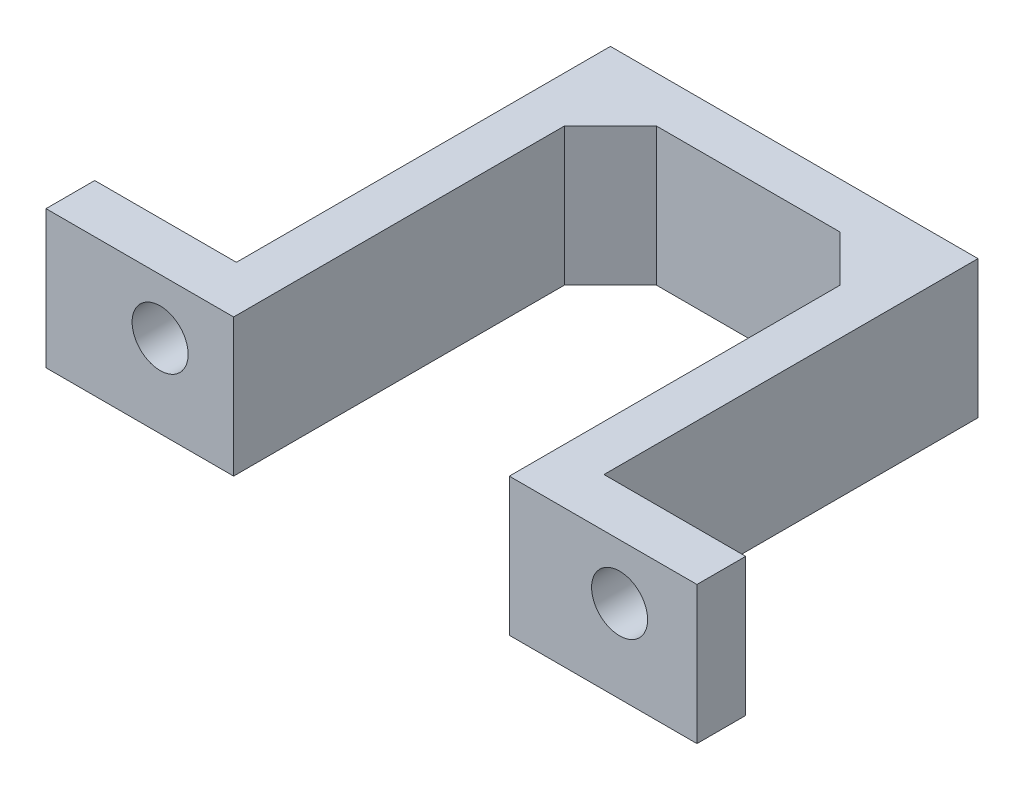
ISO-10303-21;
HEADER;
FILE_DESCRIPTION(('STEP AP214'),'2;1');
FILE_NAME('part.step','',(''),(''),'','','');
FILE_SCHEMA(('AUTOMOTIVE_DESIGN { 1 0 10303 214 1 1 1 1 }'));
ENDSEC;
DATA;
#1=APPLICATION_CONTEXT('core data for automotive mechanical design processes');
#2=APPLICATION_PROTOCOL_DEFINITION('international standard','automotive_design',2000,#1);
#3=PRODUCT_CONTEXT('',#1,'mechanical');
#4=PRODUCT('Part','Part','',(#3));
#5=PRODUCT_RELATED_PRODUCT_CATEGORY('part','',(#4));
#6=PRODUCT_DEFINITION_FORMATION('','',#4);
#7=PRODUCT_DEFINITION_CONTEXT('part definition',#1,'design');
#8=PRODUCT_DEFINITION('design','',#6,#7);
#9=PRODUCT_DEFINITION_SHAPE('','',#8);
#10=(LENGTH_UNIT() NAMED_UNIT(*) SI_UNIT(.MILLI.,.METRE.));
#11=(NAMED_UNIT(*) PLANE_ANGLE_UNIT() SI_UNIT($,.RADIAN.));
#12=(NAMED_UNIT(*) SI_UNIT($,.STERADIAN.) SOLID_ANGLE_UNIT());
#13=UNCERTAINTY_MEASURE_WITH_UNIT(LENGTH_MEASURE(1.E-05),#10,'distance_accuracy_value','');
#14=(GEOMETRIC_REPRESENTATION_CONTEXT(3) GLOBAL_UNCERTAINTY_ASSIGNED_CONTEXT((#13)) GLOBAL_UNIT_ASSIGNED_CONTEXT((#10,
#11,#12)) REPRESENTATION_CONTEXT('',''));
#15=CARTESIAN_POINT('',(0.,0.,0.));
#16=DIRECTION('',(0.,0.,1.));
#17=DIRECTION('',(1.,0.,0.));
#18=AXIS2_PLACEMENT_3D('',#15,#16,#17);
#19=CARTESIAN_POINT('',(31.9173098006345,15.,35.6989528795811));
#20=DIRECTION('',(0.,0.,1.));
#21=DIRECTION('',(1.,0.,0.));
#22=AXIS2_PLACEMENT_3D('',#19,#20,#21);
#23=PLANE('',#22);
#24=CARTESIAN_POINT('',(23.5,9.,35.6989528795811));
#25=DIRECTION('',(0.,0.,-1.));
#26=DIRECTION('',(-1.,0.,0.));
#27=AXIS2_PLACEMENT_3D('',#24,#25,#26);
#28=CIRCLE('',#27,3.05);
#29=CARTESIAN_POINT('',(20.45,9.,35.6989528795811));
#30=VERTEX_POINT('',#29);
#31=EDGE_CURVE('E242',#30,#30,#28,.T.);
#32=ORIENTED_EDGE('',*,*,#31,.F.);
#33=EDGE_LOOP('',(#32));
#34=FACE_BOUND('',#33,.T.);
#35=DIRECTION('',(-1.,0.,0.));
#36=VECTOR('',#35,1.);
#37=CARTESIAN_POINT('',(31.9173098006345,0.,35.6989528795811));
#38=LINE('',#37,#36);
#39=CARTESIAN_POINT('',(31.9173098006345,0.,35.6989528795811));
#40=VERTEX_POINT('',#39);
#41=CARTESIAN_POINT('',(16.5,0.,35.6989528795811));
#42=VERTEX_POINT('',#41);
#43=EDGE_CURVE('E176',#40,#42,#38,.T.);
#44=ORIENTED_EDGE('',*,*,#43,.T.);
#45=DIRECTION('',(0.,-1.,0.));
#46=VECTOR('',#45,1.);
#47=CARTESIAN_POINT('',(16.5,15.,35.6989528795811));
#48=LINE('',#47,#46);
#49=CARTESIAN_POINT('',(16.5,15.,35.6989528795811));
#50=VERTEX_POINT('',#49);
#51=EDGE_CURVE('E11',#50,#42,#48,.T.);
#52=ORIENTED_EDGE('',*,*,#51,.F.);
#53=DIRECTION('',(-1.,0.,0.));
#54=VECTOR('',#53,1.);
#55=CARTESIAN_POINT('',(31.9173098006345,15.,35.6989528795811));
#56=LINE('',#55,#54);
#57=CARTESIAN_POINT('',(31.9173098006345,15.,35.6989528795811));
#58=VERTEX_POINT('',#57);
#59=EDGE_CURVE('E204',#58,#50,#56,.T.);
#60=ORIENTED_EDGE('',*,*,#59,.F.);
#61=DIRECTION('',(0.,-1.,0.));
#62=VECTOR('',#61,1.);
#63=CARTESIAN_POINT('',(31.9173098006345,15.,35.6989528795811));
#64=LINE('',#63,#62);
#65=EDGE_CURVE('E172',#58,#40,#64,.T.);
#66=ORIENTED_EDGE('',*,*,#65,.T.);
#67=EDGE_LOOP('',(#44,#52,#60,#66));
#68=FACE_BOUND('',#67,.T.);
#69=ADVANCED_FACE('F33',(#34,#68),#23,.F.);
#70=CARTESIAN_POINT('',(16.5,15.,35.6989528795811));
#71=DIRECTION('',(-1.,0.,0.));
#72=DIRECTION('',(0.,0.,1.));
#73=AXIS2_PLACEMENT_3D('',#70,#71,#72);
#74=PLANE('',#73);
#75=DIRECTION('',(0.,0.,-1.));
#76=VECTOR('',#75,1.);
#77=CARTESIAN_POINT('',(16.5,0.,35.6989528795811));
#78=LINE('',#77,#76);
#79=CARTESIAN_POINT('',(16.5,0.,-5.));
#80=VERTEX_POINT('',#79);
#81=EDGE_CURVE('E179',#42,#80,#78,.T.);
#82=ORIENTED_EDGE('',*,*,#81,.T.);
#83=DIRECTION('',(0.,-1.,0.));
#84=VECTOR('',#83,1.);
#85=CARTESIAN_POINT('',(16.5,15.,-5.));
#86=LINE('',#85,#84);
#87=CARTESIAN_POINT('',(16.5,15.,-5.));
#88=VERTEX_POINT('',#87);
#89=EDGE_CURVE('E41',#88,#80,#86,.T.);
#90=ORIENTED_EDGE('',*,*,#89,.F.);
#91=DIRECTION('',(0.,0.,-1.));
#92=VECTOR('',#91,1.);
#93=CARTESIAN_POINT('',(16.5,15.,35.6989528795811));
#94=LINE('',#93,#92);
#95=EDGE_CURVE('E116',#50,#88,#94,.T.);
#96=ORIENTED_EDGE('',*,*,#95,.F.);
#97=ORIENTED_EDGE('',*,*,#51,.T.);
#98=EDGE_LOOP('',(#82,#90,#96,#97));
#99=FACE_BOUND('',#98,.T.);
#100=ADVANCED_FACE('F282',(#99),#74,.F.);
#101=CARTESIAN_POINT('',(16.5,15.,-5.));
#102=DIRECTION('',(0.,0.,1.));
#103=DIRECTION('',(1.,0.,0.));
#104=AXIS2_PLACEMENT_3D('',#101,#102,#103);
#105=PLANE('',#104);
#106=DIRECTION('',(-1.,0.,0.));
#107=VECTOR('',#106,1.);
#108=CARTESIAN_POINT('',(16.5,0.,-5.));
#109=LINE('',#108,#107);
#110=CARTESIAN_POINT('',(-23.5,0.,-5.));
#111=VERTEX_POINT('',#110);
#112=EDGE_CURVE('E181',#80,#111,#109,.T.);
#113=ORIENTED_EDGE('',*,*,#112,.T.);
#114=DIRECTION('',(0.,-1.,0.));
#115=VECTOR('',#114,1.);
#116=CARTESIAN_POINT('',(-23.5,15.,-5.));
#117=LINE('',#116,#115);
#118=CARTESIAN_POINT('',(-23.5,15.,-5.));
#119=VERTEX_POINT('',#118);
#120=EDGE_CURVE('E230',#119,#111,#117,.T.);
#121=ORIENTED_EDGE('',*,*,#120,.F.);
#122=DIRECTION('',(-1.,0.,0.));
#123=VECTOR('',#122,1.);
#124=CARTESIAN_POINT('',(16.5,15.,-5.));
#125=LINE('',#124,#123);
#126=EDGE_CURVE('E248',#88,#119,#125,.T.);
#127=ORIENTED_EDGE('',*,*,#126,.F.);
#128=ORIENTED_EDGE('',*,*,#89,.T.);
#129=EDGE_LOOP('',(#113,#121,#127,#128));
#130=FACE_BOUND('',#129,.T.);
#131=ADVANCED_FACE('F285',(#130),#105,.F.);
#132=CARTESIAN_POINT('',(-23.5,15.,-5.));
#133=DIRECTION('',(1.,0.,0.));
#134=DIRECTION('',(0.,0.,-1.));
#135=AXIS2_PLACEMENT_3D('',#132,#133,#134);
#136=PLANE('',#135);
#137=DIRECTION('',(0.,0.,1.));
#138=VECTOR('',#137,1.);
#139=CARTESIAN_POINT('',(-23.5,0.,-5.));
#140=LINE('',#139,#138);
#141=CARTESIAN_POINT('',(-23.5,0.,35.6989528795811));
#142=VERTEX_POINT('',#141);
#143=EDGE_CURVE('E183',#111,#142,#140,.T.);
#144=ORIENTED_EDGE('',*,*,#143,.T.);
#145=DIRECTION('',(0.,-1.,0.));
#146=VECTOR('',#145,1.);
#147=CARTESIAN_POINT('',(-23.5,15.,35.6989528795811));
#148=LINE('',#147,#146);
#149=CARTESIAN_POINT('',(-23.5,8.44999999999997,35.6989528795811));
#150=VERTEX_POINT('',#149);
#151=EDGE_CURVE('E226',#150,#142,#148,.T.);
#152=ORIENTED_EDGE('',*,*,#151,.F.);
#153=CARTESIAN_POINT('',(-23.5,9.55000000000003,35.6989528795811));
#154=VERTEX_POINT('',#153);
#155=EDGE_CURVE('E231',#154,#150,#148,.T.);
#156=ORIENTED_EDGE('',*,*,#155,.F.);
#157=CARTESIAN_POINT('',(-23.5,15.,35.6989528795811));
#158=VERTEX_POINT('',#157);
#159=EDGE_CURVE('E227',#158,#154,#148,.T.);
#160=ORIENTED_EDGE('',*,*,#159,.F.);
#161=DIRECTION('',(0.,0.,1.));
#162=VECTOR('',#161,1.);
#163=CARTESIAN_POINT('',(-23.5,15.,-5.));
#164=LINE('',#163,#162);
#165=EDGE_CURVE('E250',#119,#158,#164,.T.);
#166=ORIENTED_EDGE('',*,*,#165,.F.);
#167=ORIENTED_EDGE('',*,*,#120,.T.);
#168=EDGE_LOOP('',(#144,#152,#156,#160,#166,#167));
#169=FACE_BOUND('',#168,.T.);
#170=ADVANCED_FACE('F290',(#169),#136,.F.);
#171=CARTESIAN_POINT('',(-23.5,15.,35.6989528795811));
#172=DIRECTION('',(0.,0.,1.));
#173=DIRECTION('',(1.,0.,0.));
#174=AXIS2_PLACEMENT_3D('',#171,#172,#173);
#175=PLANE('',#174);
#176=ORIENTED_EDGE('',*,*,#159,.T.);
#177=CARTESIAN_POINT('',(-26.5,9.,35.6989528795811));
#178=DIRECTION('',(0.,0.,-1.));
#179=DIRECTION('',(-1.,0.,0.));
#180=AXIS2_PLACEMENT_3D('',#177,#178,#179);
#181=CIRCLE('',#180,3.05);
#182=EDGE_CURVE('E240',#150,#154,#181,.T.);
#183=ORIENTED_EDGE('',*,*,#182,.F.);
#184=ORIENTED_EDGE('',*,*,#151,.T.);
#185=DIRECTION('',(-1.,0.,0.));
#186=VECTOR('',#185,1.);
#187=CARTESIAN_POINT('',(-23.5,0.,35.6989528795811));
#188=LINE('',#187,#186);
#189=CARTESIAN_POINT('',(-38.9173098006345,0.,35.6989528795811));
#190=VERTEX_POINT('',#189);
#191=EDGE_CURVE('E186',#142,#190,#188,.T.);
#192=ORIENTED_EDGE('',*,*,#191,.T.);
#193=DIRECTION('',(0.,-1.,0.));
#194=VECTOR('',#193,1.);
#195=CARTESIAN_POINT('',(-38.9173098006345,15.,35.6989528795811));
#196=LINE('',#195,#194);
#197=CARTESIAN_POINT('',(-38.9173098006345,15.,35.6989528795811));
#198=VERTEX_POINT('',#197);
#199=EDGE_CURVE('E223',#198,#190,#196,.T.);
#200=ORIENTED_EDGE('',*,*,#199,.F.);
#201=DIRECTION('',(-1.,0.,0.));
#202=VECTOR('',#201,1.);
#203=CARTESIAN_POINT('',(-23.5,15.,35.6989528795811));
#204=LINE('',#203,#202);
#205=EDGE_CURVE('E252',#158,#198,#204,.T.);
#206=ORIENTED_EDGE('',*,*,#205,.F.);
#207=EDGE_LOOP('',(#176,#183,#184,#192,#200,#206));
#208=FACE_BOUND('',#207,.T.);
#209=ADVANCED_FACE('F297',(#208),#175,.F.);
#210=CARTESIAN_POINT('',(-38.9173098006345,15.,35.6989528795811));
#211=DIRECTION('',(1.,0.,0.));
#212=DIRECTION('',(0.,0.,-1.));
#213=AXIS2_PLACEMENT_3D('',#210,#211,#212);
#214=PLANE('',#213);
#215=DIRECTION('',(0.,0.,1.));
#216=VECTOR('',#215,1.);
#217=CARTESIAN_POINT('',(-38.9173098006345,0.,35.6989528795811));
#218=LINE('',#217,#216);
#219=CARTESIAN_POINT('',(-38.9173098006345,0.,41.));
#220=VERTEX_POINT('',#219);
#221=EDGE_CURVE('E188',#190,#220,#218,.T.);
#222=ORIENTED_EDGE('',*,*,#221,.T.);
#223=DIRECTION('',(0.,-1.,0.));
#224=VECTOR('',#223,1.);
#225=CARTESIAN_POINT('',(-38.9173098006345,15.,41.));
#226=LINE('',#225,#224);
#227=CARTESIAN_POINT('',(-38.9173098006345,15.,41.));
#228=VERTEX_POINT('',#227);
#229=EDGE_CURVE('E220',#228,#220,#226,.T.);
#230=ORIENTED_EDGE('',*,*,#229,.F.);
#231=DIRECTION('',(0.,0.,1.));
#232=VECTOR('',#231,1.);
#233=CARTESIAN_POINT('',(-38.9173098006345,15.,35.6989528795811));
#234=LINE('',#233,#232);
#235=EDGE_CURVE('E254',#198,#228,#234,.T.);
#236=ORIENTED_EDGE('',*,*,#235,.F.);
#237=ORIENTED_EDGE('',*,*,#199,.T.);
#238=EDGE_LOOP('',(#222,#230,#236,#237));
#239=FACE_BOUND('',#238,.T.);
#240=ADVANCED_FACE('F301',(#239),#214,.F.);
#241=CARTESIAN_POINT('',(-38.9173098006345,15.,41.));
#242=DIRECTION('',(0.,0.,-1.));
#243=DIRECTION('',(-1.,0.,0.));
#244=AXIS2_PLACEMENT_3D('',#241,#242,#243);
#245=PLANE('',#244);
#246=CARTESIAN_POINT('',(-26.5,9.,41.));
#247=DIRECTION('',(0.,0.,-1.));
#248=DIRECTION('',(-1.,0.,0.));
#249=AXIS2_PLACEMENT_3D('',#246,#247,#248);
#250=CIRCLE('',#249,3.05);
#251=CARTESIAN_POINT('',(-29.55,9.,41.));
#252=VERTEX_POINT('',#251);
#253=EDGE_CURVE('E36',#252,#252,#250,.T.);
#254=ORIENTED_EDGE('',*,*,#253,.T.);
#255=EDGE_LOOP('',(#254));
#256=FACE_BOUND('',#255,.T.);
#257=DIRECTION('',(1.,0.,0.));
#258=VECTOR('',#257,1.);
#259=CARTESIAN_POINT('',(-38.9173098006345,0.,41.));
#260=LINE('',#259,#258);
#261=CARTESIAN_POINT('',(-18.5,0.,41.));
#262=VERTEX_POINT('',#261);
#263=EDGE_CURVE('E190',#220,#262,#260,.T.);
#264=ORIENTED_EDGE('',*,*,#263,.T.);
#265=DIRECTION('',(0.,-1.,0.));
#266=VECTOR('',#265,1.);
#267=CARTESIAN_POINT('',(-18.5,15.,41.));
#268=LINE('',#267,#266);
#269=CARTESIAN_POINT('',(-18.5,15.,41.));
#270=VERTEX_POINT('',#269);
#271=EDGE_CURVE('E217',#270,#262,#268,.T.);
#272=ORIENTED_EDGE('',*,*,#271,.F.);
#273=DIRECTION('',(1.,0.,0.));
#274=VECTOR('',#273,1.);
#275=CARTESIAN_POINT('',(-38.9173098006345,15.,41.));
#276=LINE('',#275,#274);
#277=EDGE_CURVE('E256',#228,#270,#276,.T.);
#278=ORIENTED_EDGE('',*,*,#277,.F.);
#279=ORIENTED_EDGE('',*,*,#229,.T.);
#280=EDGE_LOOP('',(#264,#272,#278,#279));
#281=FACE_BOUND('',#280,.T.);
#282=ADVANCED_FACE('F306',(#256,#281),#245,.F.);
#283=CARTESIAN_POINT('',(-18.5,15.,41.));
#284=DIRECTION('',(-1.,0.,0.));
#285=DIRECTION('',(0.,0.,1.));
#286=AXIS2_PLACEMENT_3D('',#283,#284,#285);
#287=PLANE('',#286);
#288=DIRECTION('',(0.,0.,-1.));
#289=VECTOR('',#288,1.);
#290=CARTESIAN_POINT('',(-18.5,0.,41.));
#291=LINE('',#290,#289);
#292=CARTESIAN_POINT('',(-18.5,0.,5.));
#293=VERTEX_POINT('',#292);
#294=EDGE_CURVE('E192',#262,#293,#291,.T.);
#295=ORIENTED_EDGE('',*,*,#294,.T.);
#296=DIRECTION('',(0.,-1.,0.));
#297=VECTOR('',#296,1.);
#298=CARTESIAN_POINT('',(-18.5,15.,5.));
#299=LINE('',#298,#297);
#300=CARTESIAN_POINT('',(-18.5,15.,5.));
#301=VERTEX_POINT('',#300);
#302=EDGE_CURVE('E214',#301,#293,#299,.T.);
#303=ORIENTED_EDGE('',*,*,#302,.F.);
#304=DIRECTION('',(0.,0.,-1.));
#305=VECTOR('',#304,1.);
#306=CARTESIAN_POINT('',(-18.5,15.,41.));
#307=LINE('',#306,#305);
#308=EDGE_CURVE('E258',#270,#301,#307,.T.);
#309=ORIENTED_EDGE('',*,*,#308,.F.);
#310=ORIENTED_EDGE('',*,*,#271,.T.);
#311=EDGE_LOOP('',(#295,#303,#309,#310));
#312=FACE_BOUND('',#311,.T.);
#313=ADVANCED_FACE('F310',(#312),#287,.F.);
#314=CARTESIAN_POINT('',(-18.5,15.,5.));
#315=DIRECTION('',(-0.707106781186547,0.,-0.707106781186548));
#316=DIRECTION('',(-0.707106781186548,0.,0.707106781186547));
#317=AXIS2_PLACEMENT_3D('',#314,#315,#316);
#318=PLANE('',#317);
#319=DIRECTION('',(0.707106781186548,0.,-0.707106781186547));
#320=VECTOR('',#319,1.);
#321=CARTESIAN_POINT('',(-18.5,0.,5.));
#322=LINE('',#321,#320);
#323=CARTESIAN_POINT('',(-13.5,0.,0.));
#324=VERTEX_POINT('',#323);
#325=EDGE_CURVE('E194',#293,#324,#322,.T.);
#326=ORIENTED_EDGE('',*,*,#325,.T.);
#327=DIRECTION('',(0.,-1.,0.));
#328=VECTOR('',#327,1.);
#329=CARTESIAN_POINT('',(-13.5,15.,0.));
#330=LINE('',#329,#328);
#331=CARTESIAN_POINT('',(-13.5,15.,0.));
#332=VERTEX_POINT('',#331);
#333=EDGE_CURVE('E211',#332,#324,#330,.T.);
#334=ORIENTED_EDGE('',*,*,#333,.F.);
#335=DIRECTION('',(0.707106781186548,0.,-0.707106781186547));
#336=VECTOR('',#335,1.);
#337=CARTESIAN_POINT('',(-18.5,15.,5.));
#338=LINE('',#337,#336);
#339=EDGE_CURVE('E260',#301,#332,#338,.T.);
#340=ORIENTED_EDGE('',*,*,#339,.F.);
#341=ORIENTED_EDGE('',*,*,#302,.T.);
#342=EDGE_LOOP('',(#326,#334,#340,#341));
#343=FACE_BOUND('',#342,.T.);
#344=ADVANCED_FACE('F314',(#343),#318,.F.);
#345=CARTESIAN_POINT('',(-13.5,15.,0.));
#346=DIRECTION('',(0.,0.,-1.));
#347=DIRECTION('',(-1.,0.,0.));
#348=AXIS2_PLACEMENT_3D('',#345,#346,#347);
#349=PLANE('',#348);
#350=DIRECTION('',(1.,0.,0.));
#351=VECTOR('',#350,1.);
#352=CARTESIAN_POINT('',(-13.5,0.,0.));
#353=LINE('',#352,#351);
#354=CARTESIAN_POINT('',(6.5,0.,0.));
#355=VERTEX_POINT('',#354);
#356=EDGE_CURVE('E196',#324,#355,#353,.T.);
#357=ORIENTED_EDGE('',*,*,#356,.T.);
#358=DIRECTION('',(0.,-1.,0.));
#359=VECTOR('',#358,1.);
#360=CARTESIAN_POINT('',(6.5,15.,0.));
#361=LINE('',#360,#359);
#362=CARTESIAN_POINT('',(6.5,15.,0.));
#363=VERTEX_POINT('',#362);
#364=EDGE_CURVE('E208',#363,#355,#361,.T.);
#365=ORIENTED_EDGE('',*,*,#364,.F.);
#366=DIRECTION('',(1.,0.,0.));
#367=VECTOR('',#366,1.);
#368=CARTESIAN_POINT('',(-13.5,15.,0.));
#369=LINE('',#368,#367);
#370=EDGE_CURVE('E262',#332,#363,#369,.T.);
#371=ORIENTED_EDGE('',*,*,#370,.F.);
#372=ORIENTED_EDGE('',*,*,#333,.T.);
#373=EDGE_LOOP('',(#357,#365,#371,#372));
#374=FACE_BOUND('',#373,.T.);
#375=ADVANCED_FACE('F268',(#374),#349,.F.);
#376=CARTESIAN_POINT('',(6.5,15.,0.));
#377=DIRECTION('',(0.707106781186547,0.,-0.707106781186547));
#378=DIRECTION('',(-0.707106781186548,0.,-0.707106781186548));
#379=AXIS2_PLACEMENT_3D('',#376,#377,#378);
#380=PLANE('',#379);
#381=DIRECTION('',(0.707106781186548,0.,0.707106781186548));
#382=VECTOR('',#381,1.);
#383=CARTESIAN_POINT('',(6.5,0.,0.));
#384=LINE('',#383,#382);
#385=CARTESIAN_POINT('',(11.5,0.,5.));
#386=VERTEX_POINT('',#385);
#387=EDGE_CURVE('E198',#355,#386,#384,.T.);
#388=ORIENTED_EDGE('',*,*,#387,.T.);
#389=DIRECTION('',(0.,-1.,0.));
#390=VECTOR('',#389,1.);
#391=CARTESIAN_POINT('',(11.5,15.,5.));
#392=LINE('',#391,#390);
#393=CARTESIAN_POINT('',(11.5,15.,5.));
#394=VERTEX_POINT('',#393);
#395=EDGE_CURVE('E167',#394,#386,#392,.T.);
#396=ORIENTED_EDGE('',*,*,#395,.F.);
#397=DIRECTION('',(0.707106781186548,0.,0.707106781186548));
#398=VECTOR('',#397,1.);
#399=CARTESIAN_POINT('',(6.5,15.,0.));
#400=LINE('',#399,#398);
#401=EDGE_CURVE('E155',#363,#394,#400,.T.);
#402=ORIENTED_EDGE('',*,*,#401,.F.);
#403=ORIENTED_EDGE('',*,*,#364,.T.);
#404=EDGE_LOOP('',(#388,#396,#402,#403));
#405=FACE_BOUND('',#404,.T.);
#406=ADVANCED_FACE('F272',(#405),#380,.F.);
#407=CARTESIAN_POINT('',(11.5,15.,5.));
#408=DIRECTION('',(1.,0.,0.));
#409=DIRECTION('',(0.,0.,-1.));
#410=AXIS2_PLACEMENT_3D('',#407,#408,#409);
#411=PLANE('',#410);
#412=DIRECTION('',(0.,0.,1.));
#413=VECTOR('',#412,1.);
#414=CARTESIAN_POINT('',(11.5,0.,5.));
#415=LINE('',#414,#413);
#416=CARTESIAN_POINT('',(11.5,0.,41.));
#417=VERTEX_POINT('',#416);
#418=EDGE_CURVE('E164',#386,#417,#415,.T.);
#419=ORIENTED_EDGE('',*,*,#418,.T.);
#420=DIRECTION('',(0.,-1.,0.));
#421=VECTOR('',#420,1.);
#422=CARTESIAN_POINT('',(11.5,15.,41.));
#423=LINE('',#422,#421);
#424=CARTESIAN_POINT('',(11.5,15.,41.));
#425=VERTEX_POINT('',#424);
#426=EDGE_CURVE('E161',#425,#417,#423,.T.);
#427=ORIENTED_EDGE('',*,*,#426,.F.);
#428=DIRECTION('',(0.,0.,1.));
#429=VECTOR('',#428,1.);
#430=CARTESIAN_POINT('',(11.5,15.,5.));
#431=LINE('',#430,#429);
#432=EDGE_CURVE('E148',#394,#425,#431,.T.);
#433=ORIENTED_EDGE('',*,*,#432,.F.);
#434=ORIENTED_EDGE('',*,*,#395,.T.);
#435=EDGE_LOOP('',(#419,#427,#433,#434));
#436=FACE_BOUND('',#435,.T.);
#437=ADVANCED_FACE('F162',(#436),#411,.F.);
#438=CARTESIAN_POINT('',(11.5,15.,41.));
#439=DIRECTION('',(0.,0.,-1.));
#440=DIRECTION('',(-1.,0.,0.));
#441=AXIS2_PLACEMENT_3D('',#438,#439,#440);
#442=PLANE('',#441);
#443=CARTESIAN_POINT('',(23.5,9.,41.));
#444=DIRECTION('',(0.,0.,-1.));
#445=DIRECTION('',(-1.,0.,0.));
#446=AXIS2_PLACEMENT_3D('',#443,#444,#445);
#447=CIRCLE('',#446,3.05);
#448=CARTESIAN_POINT('',(20.45,9.,41.));
#449=VERTEX_POINT('',#448);
#450=EDGE_CURVE('E235',#449,#449,#447,.T.);
#451=ORIENTED_EDGE('',*,*,#450,.T.);
#452=EDGE_LOOP('',(#451));
#453=FACE_BOUND('',#452,.T.);
#454=DIRECTION('',(1.,0.,0.));
#455=VECTOR('',#454,1.);
#456=CARTESIAN_POINT('',(11.5,0.,41.));
#457=LINE('',#456,#455);
#458=CARTESIAN_POINT('',(31.9173098006345,0.,41.));
#459=VERTEX_POINT('',#458);
#460=EDGE_CURVE('E201',#417,#459,#457,.T.);
#461=ORIENTED_EDGE('',*,*,#460,.T.);
#462=DIRECTION('',(0.,-1.,0.));
#463=VECTOR('',#462,1.);
#464=CARTESIAN_POINT('',(31.9173098006345,15.,41.));
#465=LINE('',#464,#463);
#466=CARTESIAN_POINT('',(31.9173098006345,15.,41.));
#467=VERTEX_POINT('',#466);
#468=EDGE_CURVE('E168',#467,#459,#465,.T.);
#469=ORIENTED_EDGE('',*,*,#468,.F.);
#470=DIRECTION('',(1.,0.,0.));
#471=VECTOR('',#470,1.);
#472=CARTESIAN_POINT('',(11.5,15.,41.));
#473=LINE('',#472,#471);
#474=EDGE_CURVE('E152',#425,#467,#473,.T.);
#475=ORIENTED_EDGE('',*,*,#474,.F.);
#476=ORIENTED_EDGE('',*,*,#426,.T.);
#477=EDGE_LOOP('',(#461,#469,#475,#476));
#478=FACE_BOUND('',#477,.T.);
#479=ADVANCED_FACE('F170',(#453,#478),#442,.F.);
#480=CARTESIAN_POINT('',(31.9173098006345,15.,41.));
#481=DIRECTION('',(-1.,0.,0.));
#482=DIRECTION('',(0.,0.,1.));
#483=AXIS2_PLACEMENT_3D('',#480,#481,#482);
#484=PLANE('',#483);
#485=DIRECTION('',(0.,0.,-1.));
#486=VECTOR('',#485,1.);
#487=CARTESIAN_POINT('',(31.9173098006345,0.,41.));
#488=LINE('',#487,#486);
#489=EDGE_CURVE('E108',#459,#40,#488,.T.);
#490=ORIENTED_EDGE('',*,*,#489,.T.);
#491=ORIENTED_EDGE('',*,*,#65,.F.);
#492=DIRECTION('',(0.,0.,-1.));
#493=VECTOR('',#492,1.);
#494=CARTESIAN_POINT('',(31.9173098006345,15.,41.));
#495=LINE('',#494,#493);
#496=EDGE_CURVE('E57',#467,#58,#495,.T.);
#497=ORIENTED_EDGE('',*,*,#496,.F.);
#498=ORIENTED_EDGE('',*,*,#468,.T.);
#499=EDGE_LOOP('',(#490,#491,#497,#498));
#500=FACE_BOUND('',#499,.T.);
#501=ADVANCED_FACE('F276',(#500),#484,.F.);
#502=CARTESIAN_POINT('',(0.,15.,0.));
#503=DIRECTION('',(0.,-1.,0.));
#504=DIRECTION('',(0.,0.,-1.));
#505=AXIS2_PLACEMENT_3D('',#502,#503,#504);
#506=PLANE('',#505);
#507=ORIENTED_EDGE('',*,*,#59,.T.);
#508=ORIENTED_EDGE('',*,*,#95,.T.);
#509=ORIENTED_EDGE('',*,*,#126,.T.);
#510=ORIENTED_EDGE('',*,*,#165,.T.);
#511=ORIENTED_EDGE('',*,*,#205,.T.);
#512=ORIENTED_EDGE('',*,*,#235,.T.);
#513=ORIENTED_EDGE('',*,*,#277,.T.);
#514=ORIENTED_EDGE('',*,*,#308,.T.);
#515=ORIENTED_EDGE('',*,*,#339,.T.);
#516=ORIENTED_EDGE('',*,*,#370,.T.);
#517=ORIENTED_EDGE('',*,*,#401,.T.);
#518=ORIENTED_EDGE('',*,*,#432,.T.);
#519=ORIENTED_EDGE('',*,*,#474,.T.);
#520=ORIENTED_EDGE('',*,*,#496,.T.);
#521=EDGE_LOOP('',(#507,#508,#509,#510,#511,#512,#513,#514,#515,#516,#517,#518,#519,#520));
#522=FACE_BOUND('',#521,.T.);
#523=ADVANCED_FACE('F150',(#522),#506,.F.);
#524=CARTESIAN_POINT('',(0.,0.,0.));
#525=DIRECTION('',(0.,-1.,0.));
#526=DIRECTION('',(0.,0.,-1.));
#527=AXIS2_PLACEMENT_3D('',#524,#525,#526);
#528=PLANE('',#527);
#529=ORIENTED_EDGE('',*,*,#43,.F.);
#530=ORIENTED_EDGE('',*,*,#489,.F.);
#531=ORIENTED_EDGE('',*,*,#460,.F.);
#532=ORIENTED_EDGE('',*,*,#418,.F.);
#533=ORIENTED_EDGE('',*,*,#387,.F.);
#534=ORIENTED_EDGE('',*,*,#356,.F.);
#535=ORIENTED_EDGE('',*,*,#325,.F.);
#536=ORIENTED_EDGE('',*,*,#294,.F.);
#537=ORIENTED_EDGE('',*,*,#263,.F.);
#538=ORIENTED_EDGE('',*,*,#221,.F.);
#539=ORIENTED_EDGE('',*,*,#191,.F.);
#540=ORIENTED_EDGE('',*,*,#143,.F.);
#541=ORIENTED_EDGE('',*,*,#112,.F.);
#542=ORIENTED_EDGE('',*,*,#81,.F.);
#543=EDGE_LOOP('',(#529,#530,#531,#532,#533,#534,#535,#536,#537,#538,#539,#540,#541,#542));
#544=FACE_BOUND('',#543,.T.);
#545=ADVANCED_FACE('F275',(#544),#528,.T.);
#546=CARTESIAN_POINT('',(23.5,9.,50.6989528795811));
#547=DIRECTION('',(0.,0.,-1.));
#548=DIRECTION('',(-1.,0.,0.));
#549=AXIS2_PLACEMENT_3D('',#546,#547,#548);
#550=CYLINDRICAL_SURFACE('',#549,3.05);
#551=ORIENTED_EDGE('',*,*,#31,.T.);
#552=EDGE_LOOP('',(#551));
#553=FACE_BOUND('',#552,.T.);
#554=ORIENTED_EDGE('',*,*,#450,.F.);
#555=EDGE_LOOP('',(#554));
#556=FACE_BOUND('',#555,.T.);
#557=ADVANCED_FACE('F340',(#553,#556),#550,.F.);
#558=CARTESIAN_POINT('',(-26.5,9.,35.6989528795811));
#559=DIRECTION('',(0.,0.,-1.));
#560=DIRECTION('',(-1.,0.,0.));
#561=AXIS2_PLACEMENT_3D('',#558,#559,#560);
#562=PLANE('',#561);
#563=EDGE_CURVE('E48',#154,#150,#181,.T.);
#564=ORIENTED_EDGE('',*,*,#563,.F.);
#565=ORIENTED_EDGE('',*,*,#155,.T.);
#566=EDGE_LOOP('',(#564,#565));
#567=FACE_BOUND('',#566,.T.);
#568=ADVANCED_FACE('F318',(#567),#562,.F.);
#569=CARTESIAN_POINT('',(-26.5,9.,50.6989528795811));
#570=DIRECTION('',(0.,0.,-1.));
#571=DIRECTION('',(-1.,0.,0.));
#572=AXIS2_PLACEMENT_3D('',#569,#570,#571);
#573=CYLINDRICAL_SURFACE('',#572,3.05);
#574=ORIENTED_EDGE('',*,*,#563,.T.);
#575=ORIENTED_EDGE('',*,*,#182,.T.);
#576=EDGE_LOOP('',(#574,#575));
#577=FACE_BOUND('',#576,.T.);
#578=ORIENTED_EDGE('',*,*,#253,.F.);
#579=EDGE_LOOP('',(#578));
#580=FACE_BOUND('',#579,.T.);
#581=ADVANCED_FACE('F319',(#577,#580),#573,.F.);
#582=CLOSED_SHELL('',(#69,#100,#131,#170,#209,#240,#282,#313,#344,#375,#406,#437,#479,#501,#523,
#545,#557,#568,#581));
#583=MANIFOLD_SOLID_BREP('B2',#582);
#584=ADVANCED_BREP_SHAPE_REPRESENTATION('',(#18,#583),#14);
#585=SHAPE_DEFINITION_REPRESENTATION(#9,#584);
ENDSEC;
END-ISO-10303-21;
